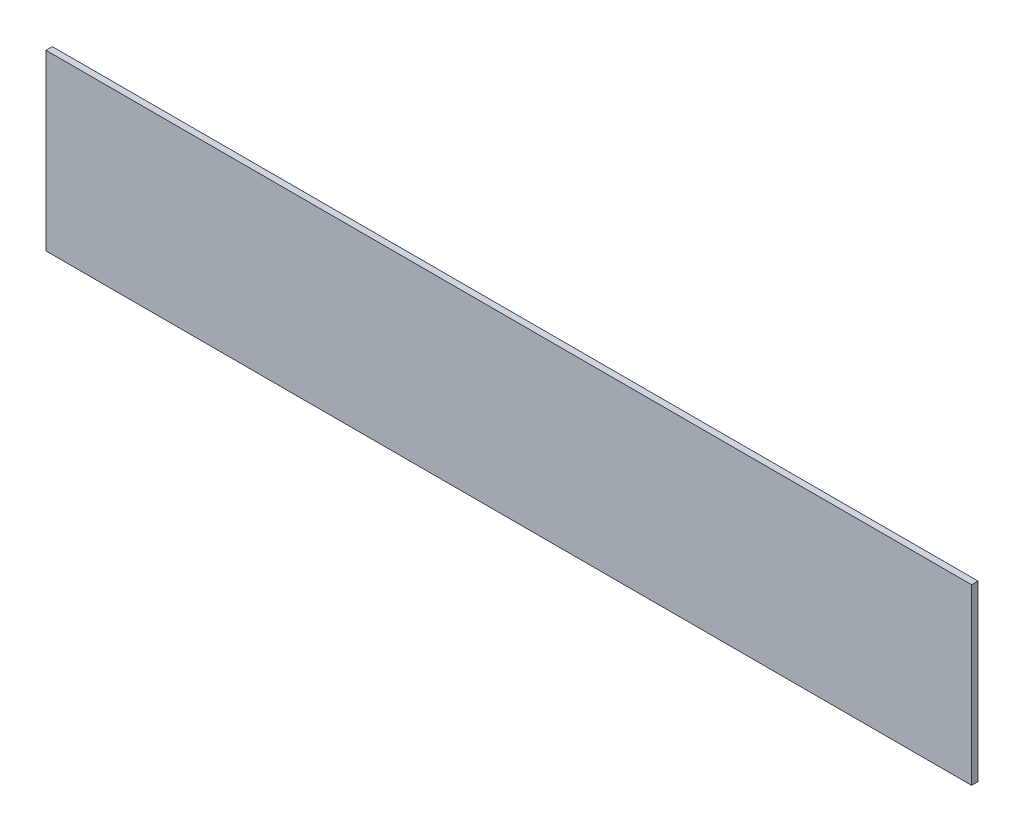
ISO-10303-21;
HEADER;
FILE_DESCRIPTION(('STEP AP214'),'2;1');
FILE_NAME('part.step','',(''),(''),'','','');
FILE_SCHEMA(('AUTOMOTIVE_DESIGN { 1 0 10303 214 1 1 1 1 }'));
ENDSEC;
DATA;
#1=APPLICATION_CONTEXT('core data for automotive mechanical design processes');
#2=APPLICATION_PROTOCOL_DEFINITION('international standard','automotive_design',2000,#1);
#3=PRODUCT_CONTEXT('',#1,'mechanical');
#4=PRODUCT('Part','Part','',(#3));
#5=PRODUCT_RELATED_PRODUCT_CATEGORY('part','',(#4));
#6=PRODUCT_DEFINITION_FORMATION('','',#4);
#7=PRODUCT_DEFINITION_CONTEXT('part definition',#1,'design');
#8=PRODUCT_DEFINITION('design','',#6,#7);
#9=PRODUCT_DEFINITION_SHAPE('','',#8);
#10=(LENGTH_UNIT() NAMED_UNIT(*) SI_UNIT(.MILLI.,.METRE.));
#11=(NAMED_UNIT(*) PLANE_ANGLE_UNIT() SI_UNIT($,.RADIAN.));
#12=(NAMED_UNIT(*) SI_UNIT($,.STERADIAN.) SOLID_ANGLE_UNIT());
#13=UNCERTAINTY_MEASURE_WITH_UNIT(LENGTH_MEASURE(1.E-05),#10,'distance_accuracy_value','');
#14=(GEOMETRIC_REPRESENTATION_CONTEXT(3) GLOBAL_UNCERTAINTY_ASSIGNED_CONTEXT((#13)) GLOBAL_UNIT_ASSIGNED_CONTEXT((#10,
#11,#12)) REPRESENTATION_CONTEXT('',''));
#15=CARTESIAN_POINT('',(0.,0.,0.));
#16=DIRECTION('',(0.,0.,1.));
#17=DIRECTION('',(1.,0.,0.));
#18=AXIS2_PLACEMENT_3D('',#15,#16,#17);
#19=CARTESIAN_POINT('',(0.,0.,1.635));
#20=DIRECTION('',(0.,0.,1.));
#21=DIRECTION('',(1.,0.,0.));
#22=AXIS2_PLACEMENT_3D('',#19,#20,#21);
#23=PLANE('',#22);
#24=DIRECTION('',(0.,-1.,0.));
#25=VECTOR('',#24,1.);
#26=CARTESIAN_POINT('',(2.53,8.975,1.635));
#27=LINE('',#26,#25);
#28=CARTESIAN_POINT('',(2.53,8.975,1.635));
#29=VERTEX_POINT('',#28);
#30=CARTESIAN_POINT('',(2.53,8.025,1.635));
#31=VERTEX_POINT('',#30);
#32=EDGE_CURVE('E25',#29,#31,#27,.T.);
#33=ORIENTED_EDGE('',*,*,#32,.F.);
#34=DIRECTION('',(1.,0.,0.));
#35=VECTOR('',#34,1.);
#36=CARTESIAN_POINT('',(-2.53,8.975,1.635));
#37=LINE('',#36,#35);
#38=CARTESIAN_POINT('',(-2.53,8.975,1.635));
#39=VERTEX_POINT('',#38);
#40=EDGE_CURVE('E104',#39,#29,#37,.T.);
#41=ORIENTED_EDGE('',*,*,#40,.F.);
#42=DIRECTION('',(0.,1.,0.));
#43=VECTOR('',#42,1.);
#44=CARTESIAN_POINT('',(-2.53,8.025,1.635));
#45=LINE('',#44,#43);
#46=CARTESIAN_POINT('',(-2.53,8.025,1.635));
#47=VERTEX_POINT('',#46);
#48=EDGE_CURVE('E83',#47,#39,#45,.T.);
#49=ORIENTED_EDGE('',*,*,#48,.F.);
#50=DIRECTION('',(-1.,0.,0.));
#51=VECTOR('',#50,1.);
#52=CARTESIAN_POINT('',(2.53,8.025,1.635));
#53=LINE('',#52,#51);
#54=EDGE_CURVE('E87',#31,#47,#53,.T.);
#55=ORIENTED_EDGE('',*,*,#54,.F.);
#56=EDGE_LOOP('',(#33,#41,#49,#55));
#57=FACE_BOUND('',#56,.T.);
#58=ADVANCED_FACE('F17',(#57),#23,.T.);
#59=CARTESIAN_POINT('',(0.,0.,1.6));
#60=DIRECTION('',(0.,0.,1.));
#61=DIRECTION('',(1.,0.,0.));
#62=AXIS2_PLACEMENT_3D('',#59,#60,#61);
#63=PLANE('',#62);
#64=DIRECTION('',(-1.,0.,0.));
#65=VECTOR('',#64,1.);
#66=CARTESIAN_POINT('',(2.53,8.025,1.6));
#67=LINE('',#66,#65);
#68=CARTESIAN_POINT('',(2.53,8.025,1.6));
#69=VERTEX_POINT('',#68);
#70=CARTESIAN_POINT('',(-2.53,8.025,1.6));
#71=VERTEX_POINT('',#70);
#72=EDGE_CURVE('E71',#69,#71,#67,.T.);
#73=ORIENTED_EDGE('',*,*,#72,.T.);
#74=DIRECTION('',(0.,1.,0.));
#75=VECTOR('',#74,1.);
#76=CARTESIAN_POINT('',(-2.53,8.025,1.6));
#77=LINE('',#76,#75);
#78=CARTESIAN_POINT('',(-2.53,8.975,1.6));
#79=VERTEX_POINT('',#78);
#80=EDGE_CURVE('E101',#71,#79,#77,.T.);
#81=ORIENTED_EDGE('',*,*,#80,.T.);
#82=DIRECTION('',(1.,0.,0.));
#83=VECTOR('',#82,1.);
#84=CARTESIAN_POINT('',(-2.53,8.975,1.6));
#85=LINE('',#84,#83);
#86=CARTESIAN_POINT('',(2.53,8.975,1.6));
#87=VERTEX_POINT('',#86);
#88=EDGE_CURVE('E73',#79,#87,#85,.T.);
#89=ORIENTED_EDGE('',*,*,#88,.T.);
#90=DIRECTION('',(0.,-1.,0.));
#91=VECTOR('',#90,1.);
#92=CARTESIAN_POINT('',(2.53,8.975,1.6));
#93=LINE('',#92,#91);
#94=EDGE_CURVE('E11',#87,#69,#93,.T.);
#95=ORIENTED_EDGE('',*,*,#94,.T.);
#96=EDGE_LOOP('',(#73,#81,#89,#95));
#97=FACE_BOUND('',#96,.T.);
#98=ADVANCED_FACE('F69',(#97),#63,.F.);
#99=CARTESIAN_POINT('',(2.53,8.975,1.6));
#100=DIRECTION('',(1.,0.,0.));
#101=DIRECTION('',(0.,1.,0.));
#102=AXIS2_PLACEMENT_3D('',#99,#100,#101);
#103=PLANE('',#102);
#104=DIRECTION('',(0.,0.,1.));
#105=VECTOR('',#104,1.);
#106=CARTESIAN_POINT('',(2.53,8.975,1.6));
#107=LINE('',#106,#105);
#108=EDGE_CURVE('E109',#87,#29,#107,.T.);
#109=ORIENTED_EDGE('',*,*,#108,.T.);
#110=ORIENTED_EDGE('',*,*,#32,.T.);
#111=DIRECTION('',(0.,0.,1.));
#112=VECTOR('',#111,1.);
#113=CARTESIAN_POINT('',(2.53,8.025,1.6));
#114=LINE('',#113,#112);
#115=EDGE_CURVE('E79',#69,#31,#114,.T.);
#116=ORIENTED_EDGE('',*,*,#115,.F.);
#117=ORIENTED_EDGE('',*,*,#94,.F.);
#118=EDGE_LOOP('',(#109,#110,#116,#117));
#119=FACE_BOUND('',#118,.T.);
#120=ADVANCED_FACE('F85',(#119),#103,.T.);
#121=CARTESIAN_POINT('',(-2.53,8.975,1.6));
#122=DIRECTION('',(0.,1.,0.));
#123=DIRECTION('',(1.,0.,0.));
#124=AXIS2_PLACEMENT_3D('',#121,#122,#123);
#125=PLANE('',#124);
#126=DIRECTION('',(0.,0.,1.));
#127=VECTOR('',#126,1.);
#128=CARTESIAN_POINT('',(-2.53,8.975,1.6));
#129=LINE('',#128,#127);
#130=EDGE_CURVE('E105',#79,#39,#129,.T.);
#131=ORIENTED_EDGE('',*,*,#130,.T.);
#132=ORIENTED_EDGE('',*,*,#40,.T.);
#133=ORIENTED_EDGE('',*,*,#108,.F.);
#134=ORIENTED_EDGE('',*,*,#88,.F.);
#135=EDGE_LOOP('',(#131,#132,#133,#134));
#136=FACE_BOUND('',#135,.T.);
#137=ADVANCED_FACE('F155',(#136),#125,.T.);
#138=CARTESIAN_POINT('',(-2.53,8.025,1.6));
#139=DIRECTION('',(-1.,0.,0.));
#140=DIRECTION('',(0.,0.,1.));
#141=AXIS2_PLACEMENT_3D('',#138,#139,#140);
#142=PLANE('',#141);
#143=DIRECTION('',(0.,0.,1.));
#144=VECTOR('',#143,1.);
#145=CARTESIAN_POINT('',(-2.53,8.025,1.6));
#146=LINE('',#145,#144);
#147=EDGE_CURVE('E81',#71,#47,#146,.T.);
#148=ORIENTED_EDGE('',*,*,#147,.T.);
#149=ORIENTED_EDGE('',*,*,#48,.T.);
#150=ORIENTED_EDGE('',*,*,#130,.F.);
#151=ORIENTED_EDGE('',*,*,#80,.F.);
#152=EDGE_LOOP('',(#148,#149,#150,#151));
#153=FACE_BOUND('',#152,.T.);
#154=ADVANCED_FACE('F153',(#153),#142,.T.);
#155=CARTESIAN_POINT('',(2.53,8.025,1.6));
#156=DIRECTION('',(0.,-1.,0.));
#157=DIRECTION('',(0.,0.,-1.));
#158=AXIS2_PLACEMENT_3D('',#155,#156,#157);
#159=PLANE('',#158);
#160=ORIENTED_EDGE('',*,*,#115,.T.);
#161=ORIENTED_EDGE('',*,*,#54,.T.);
#162=ORIENTED_EDGE('',*,*,#147,.F.);
#163=ORIENTED_EDGE('',*,*,#72,.F.);
#164=EDGE_LOOP('',(#160,#161,#162,#163));
#165=FACE_BOUND('',#164,.T.);
#166=ADVANCED_FACE('F77',(#165),#159,.T.);
#167=CLOSED_SHELL('',(#58,#98,#120,#137,#154,#166));
#168=MANIFOLD_SOLID_BREP('B1',#167);
#169=ADVANCED_BREP_SHAPE_REPRESENTATION('',(#18,#168),#14);
#170=SHAPE_DEFINITION_REPRESENTATION(#9,#169);
ENDSEC;
END-ISO-10303-21;
